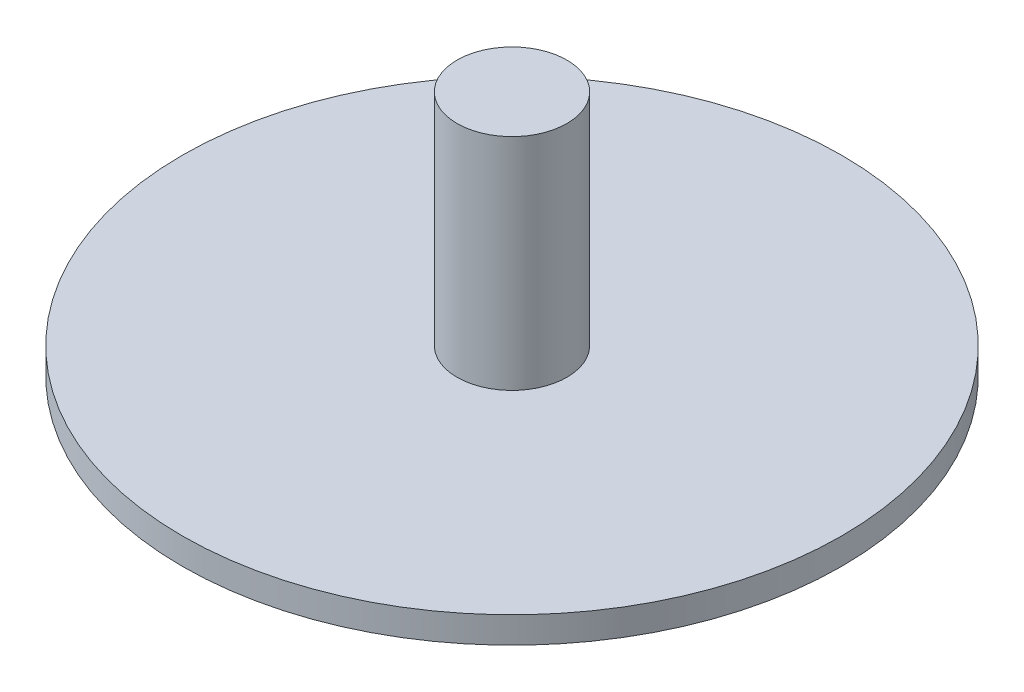
ISO-10303-21;
HEADER;
FILE_DESCRIPTION(('STEP AP214'),'2;1');
FILE_NAME('part.step','',(''),(''),'','','');
FILE_SCHEMA(('AUTOMOTIVE_DESIGN { 1 0 10303 214 1 1 1 1 }'));
ENDSEC;
DATA;
#1=APPLICATION_CONTEXT('core data for automotive mechanical design processes');
#2=APPLICATION_PROTOCOL_DEFINITION('international standard','automotive_design',2000,#1);
#3=PRODUCT_CONTEXT('',#1,'mechanical');
#4=PRODUCT('Part','Part','',(#3));
#5=PRODUCT_RELATED_PRODUCT_CATEGORY('part','',(#4));
#6=PRODUCT_DEFINITION_FORMATION('','',#4);
#7=PRODUCT_DEFINITION_CONTEXT('part definition',#1,'design');
#8=PRODUCT_DEFINITION('design','',#6,#7);
#9=PRODUCT_DEFINITION_SHAPE('','',#8);
#10=(LENGTH_UNIT() NAMED_UNIT(*) SI_UNIT(.MILLI.,.METRE.));
#11=(NAMED_UNIT(*) PLANE_ANGLE_UNIT() SI_UNIT($,.RADIAN.));
#12=(NAMED_UNIT(*) SI_UNIT($,.STERADIAN.) SOLID_ANGLE_UNIT());
#13=UNCERTAINTY_MEASURE_WITH_UNIT(LENGTH_MEASURE(1.E-05),#10,'distance_accuracy_value','');
#14=(GEOMETRIC_REPRESENTATION_CONTEXT(3) GLOBAL_UNCERTAINTY_ASSIGNED_CONTEXT((#13)) GLOBAL_UNIT_ASSIGNED_CONTEXT((#10,
#11,#12)) REPRESENTATION_CONTEXT('',''));
#15=CARTESIAN_POINT('',(0.,0.,0.));
#16=DIRECTION('',(0.,0.,1.));
#17=DIRECTION('',(1.,0.,0.));
#18=AXIS2_PLACEMENT_3D('',#15,#16,#17);
#19=CARTESIAN_POINT('',(0.,12.,0.));
#20=DIRECTION('',(0.,-1.,0.));
#21=DIRECTION('',(0.,0.,-1.));
#22=AXIS2_PLACEMENT_3D('',#19,#20,#21);
#23=CYLINDRICAL_SURFACE('',#22,150.);
#24=CARTESIAN_POINT('',(0.,12.,0.));
#25=DIRECTION('',(0.,1.,0.));
#26=DIRECTION('',(0.,0.,1.));
#27=AXIS2_PLACEMENT_3D('',#24,#25,#26);
#28=CIRCLE('',#27,150.);
#29=CARTESIAN_POINT('',(0.,12.,150.));
#30=VERTEX_POINT('',#29);
#31=EDGE_CURVE('E10',#30,#30,#28,.T.);
#32=ORIENTED_EDGE('',*,*,#31,.F.);
#33=EDGE_LOOP('',(#32));
#34=FACE_BOUND('',#33,.T.);
#35=CARTESIAN_POINT('',(0.,0.,0.));
#36=DIRECTION('',(0.,1.,0.));
#37=DIRECTION('',(0.,0.,1.));
#38=AXIS2_PLACEMENT_3D('',#35,#36,#37);
#39=CIRCLE('',#38,150.);
#40=CARTESIAN_POINT('',(0.,0.,150.));
#41=VERTEX_POINT('',#40);
#42=EDGE_CURVE('E34',#41,#41,#39,.T.);
#43=ORIENTED_EDGE('',*,*,#42,.T.);
#44=EDGE_LOOP('',(#43));
#45=FACE_BOUND('',#44,.T.);
#46=ADVANCED_FACE('F31',(#34,#45),#23,.T.);
#47=CARTESIAN_POINT('',(0.,12.,0.));
#48=DIRECTION('',(0.,1.,0.));
#49=DIRECTION('',(0.,0.,1.));
#50=AXIS2_PLACEMENT_3D('',#47,#48,#49);
#51=PLANE('',#50);
#52=CARTESIAN_POINT('',(0.,12.,0.));
#53=DIRECTION('',(0.,1.,0.));
#54=DIRECTION('',(0.,0.,1.));
#55=AXIS2_PLACEMENT_3D('',#52,#53,#54);
#56=CIRCLE('',#55,25.);
#57=CARTESIAN_POINT('',(0.,12.,25.));
#58=VERTEX_POINT('',#57);
#59=EDGE_CURVE('E43',#58,#58,#56,.T.);
#60=ORIENTED_EDGE('',*,*,#59,.F.);
#61=EDGE_LOOP('',(#60));
#62=FACE_BOUND('',#61,.T.);
#63=ORIENTED_EDGE('',*,*,#31,.T.);
#64=EDGE_LOOP('',(#63));
#65=FACE_BOUND('',#64,.T.);
#66=ADVANCED_FACE('F58',(#62,#65),#51,.T.);
#67=CARTESIAN_POINT('',(0.,0.,0.));
#68=DIRECTION('',(0.,1.,0.));
#69=DIRECTION('',(0.,0.,1.));
#70=AXIS2_PLACEMENT_3D('',#67,#68,#69);
#71=PLANE('',#70);
#72=ORIENTED_EDGE('',*,*,#42,.F.);
#73=EDGE_LOOP('',(#72));
#74=FACE_BOUND('',#73,.T.);
#75=ADVANCED_FACE('F54',(#74),#71,.F.);
#76=CARTESIAN_POINT('',(0.,112.,0.));
#77=DIRECTION('',(0.,-1.,0.));
#78=DIRECTION('',(0.,0.,-1.));
#79=AXIS2_PLACEMENT_3D('',#76,#77,#78);
#80=CYLINDRICAL_SURFACE('',#79,25.);
#81=CARTESIAN_POINT('',(0.,112.,0.));
#82=DIRECTION('',(0.,1.,0.));
#83=DIRECTION('',(0.,0.,1.));
#84=AXIS2_PLACEMENT_3D('',#81,#82,#83);
#85=CIRCLE('',#84,25.);
#86=CARTESIAN_POINT('',(0.,112.,25.));
#87=VERTEX_POINT('',#86);
#88=EDGE_CURVE('E41',#87,#87,#85,.T.);
#89=ORIENTED_EDGE('',*,*,#88,.F.);
#90=EDGE_LOOP('',(#89));
#91=FACE_BOUND('',#90,.T.);
#92=ORIENTED_EDGE('',*,*,#59,.T.);
#93=EDGE_LOOP('',(#92));
#94=FACE_BOUND('',#93,.T.);
#95=ADVANCED_FACE('F51',(#91,#94),#80,.T.);
#96=CARTESIAN_POINT('',(0.,112.,0.));
#97=DIRECTION('',(0.,1.,0.));
#98=DIRECTION('',(0.,0.,1.));
#99=AXIS2_PLACEMENT_3D('',#96,#97,#98);
#100=PLANE('',#99);
#101=ORIENTED_EDGE('',*,*,#88,.T.);
#102=EDGE_LOOP('',(#101));
#103=FACE_BOUND('',#102,.T.);
#104=ADVANCED_FACE('F49',(#103),#100,.T.);
#105=CLOSED_SHELL('',(#46,#66,#75,#95,#104));
#106=MANIFOLD_SOLID_BREP('B2',#105);
#107=ADVANCED_BREP_SHAPE_REPRESENTATION('',(#18,#106),#14);
#108=SHAPE_DEFINITION_REPRESENTATION(#9,#107);
ENDSEC;
END-ISO-10303-21;
